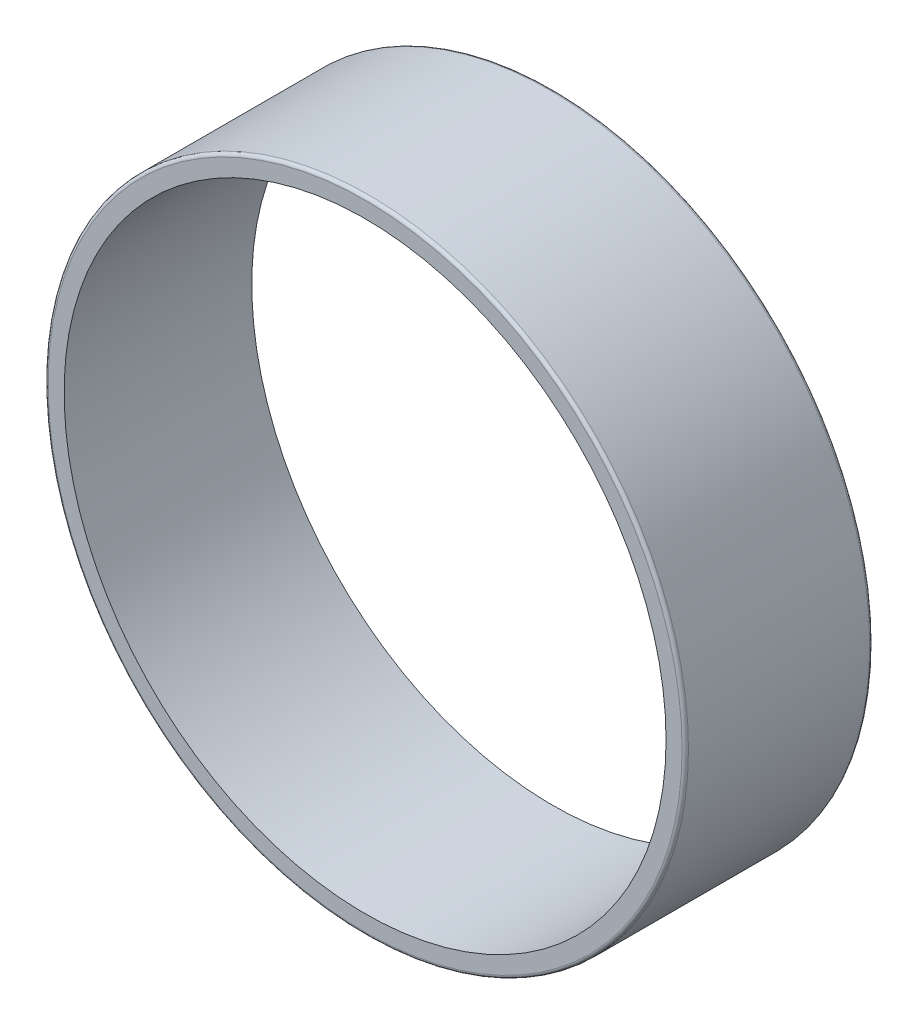
ISO-10303-21;
HEADER;
FILE_DESCRIPTION(('STEP AP214'),'2;1');
FILE_NAME('part.step','',(''),(''),'','','');
FILE_SCHEMA(('AUTOMOTIVE_DESIGN { 1 0 10303 214 1 1 1 1 }'));
ENDSEC;
DATA;
#1=APPLICATION_CONTEXT('core data for automotive mechanical design processes');
#2=APPLICATION_PROTOCOL_DEFINITION('international standard','automotive_design',2000,#1);
#3=PRODUCT_CONTEXT('',#1,'mechanical');
#4=PRODUCT('Part','Part','',(#3));
#5=PRODUCT_RELATED_PRODUCT_CATEGORY('part','',(#4));
#6=PRODUCT_DEFINITION_FORMATION('','',#4);
#7=PRODUCT_DEFINITION_CONTEXT('part definition',#1,'design');
#8=PRODUCT_DEFINITION('design','',#6,#7);
#9=PRODUCT_DEFINITION_SHAPE('','',#8);
#10=(LENGTH_UNIT() NAMED_UNIT(*) SI_UNIT(.MILLI.,.METRE.));
#11=(NAMED_UNIT(*) PLANE_ANGLE_UNIT() SI_UNIT($,.RADIAN.));
#12=(NAMED_UNIT(*) SI_UNIT($,.STERADIAN.) SOLID_ANGLE_UNIT());
#13=UNCERTAINTY_MEASURE_WITH_UNIT(LENGTH_MEASURE(1.E-05),#10,'distance_accuracy_value','');
#14=(GEOMETRIC_REPRESENTATION_CONTEXT(3) GLOBAL_UNCERTAINTY_ASSIGNED_CONTEXT((#13)) GLOBAL_UNIT_ASSIGNED_CONTEXT((#10,
#11,#12)) REPRESENTATION_CONTEXT('',''));
#15=CARTESIAN_POINT('',(0.,0.,0.));
#16=DIRECTION('',(0.,0.,1.));
#17=DIRECTION('',(1.,0.,0.));
#18=AXIS2_PLACEMENT_3D('',#15,#16,#17);
#19=CARTESIAN_POINT('',(0.,0.,29.3));
#20=DIRECTION('',(0.,0.,1.));
#21=DIRECTION('',(1.,0.,0.));
#22=AXIS2_PLACEMENT_3D('',#19,#20,#21);
#23=PLANE('',#22);
#24=CARTESIAN_POINT('',(0.,0.,29.3));
#25=DIRECTION('',(0.,0.,1.));
#26=DIRECTION('',(1.,0.,0.));
#27=AXIS2_PLACEMENT_3D('',#24,#25,#26);
#28=CIRCLE('',#27,49.5);
#29=CARTESIAN_POINT('',(49.5,0.,29.3));
#30=VERTEX_POINT('',#29);
#31=EDGE_CURVE('E10',#30,#30,#28,.T.);
#32=ORIENTED_EDGE('',*,*,#31,.T.);
#33=EDGE_LOOP('',(#32));
#34=FACE_BOUND('',#33,.T.);
#35=CARTESIAN_POINT('',(0.,0.,29.3));
#36=DIRECTION('',(0.,0.,1.));
#37=DIRECTION('',(1.,0.,0.));
#38=AXIS2_PLACEMENT_3D('',#35,#36,#37);
#39=CIRCLE('',#38,47.);
#40=CARTESIAN_POINT('',(47.,0.,29.3));
#41=VERTEX_POINT('',#40);
#42=EDGE_CURVE('E63',#41,#41,#39,.T.);
#43=ORIENTED_EDGE('',*,*,#42,.F.);
#44=EDGE_LOOP('',(#43));
#45=FACE_BOUND('',#44,.T.);
#46=ADVANCED_FACE('F39',(#34,#45),#23,.T.);
#47=CARTESIAN_POINT('',(0.,0.,0.));
#48=DIRECTION('',(0.,0.,1.));
#49=DIRECTION('',(1.,0.,0.));
#50=AXIS2_PLACEMENT_3D('',#47,#48,#49);
#51=PLANE('',#50);
#52=CARTESIAN_POINT('',(0.,0.,0.));
#53=DIRECTION('',(0.,0.,1.));
#54=DIRECTION('',(1.,0.,0.));
#55=AXIS2_PLACEMENT_3D('',#52,#53,#54);
#56=CIRCLE('',#55,49.5);
#57=CARTESIAN_POINT('',(49.5,0.,0.));
#58=VERTEX_POINT('',#57);
#59=EDGE_CURVE('E47',#58,#58,#56,.F.);
#60=ORIENTED_EDGE('',*,*,#59,.T.);
#61=EDGE_LOOP('',(#60));
#62=FACE_BOUND('',#61,.T.);
#63=CARTESIAN_POINT('',(0.,0.,0.));
#64=DIRECTION('',(0.,0.,1.));
#65=DIRECTION('',(1.,0.,0.));
#66=AXIS2_PLACEMENT_3D('',#63,#64,#65);
#67=CIRCLE('',#66,47.);
#68=CARTESIAN_POINT('',(47.,0.,0.));
#69=VERTEX_POINT('',#68);
#70=EDGE_CURVE('E64',#69,#69,#67,.T.);
#71=ORIENTED_EDGE('',*,*,#70,.T.);
#72=EDGE_LOOP('',(#71));
#73=FACE_BOUND('',#72,.T.);
#74=ADVANCED_FACE('F76',(#62,#73),#51,.F.);
#75=CARTESIAN_POINT('',(0.,0.,29.3));
#76=DIRECTION('',(0.,0.,-1.));
#77=DIRECTION('',(-1.,0.,0.));
#78=AXIS2_PLACEMENT_3D('',#75,#76,#77);
#79=CYLINDRICAL_SURFACE('',#78,50.);
#80=CARTESIAN_POINT('',(0.,0.,0.5));
#81=DIRECTION('',(0.,0.,1.));
#82=DIRECTION('',(1.,0.,0.));
#83=AXIS2_PLACEMENT_3D('',#80,#81,#82);
#84=CIRCLE('',#83,50.);
#85=CARTESIAN_POINT('',(50.,0.,0.5));
#86=VERTEX_POINT('',#85);
#87=EDGE_CURVE('E52',#86,#86,#84,.T.);
#88=ORIENTED_EDGE('',*,*,#87,.T.);
#89=EDGE_LOOP('',(#88));
#90=FACE_BOUND('',#89,.T.);
#91=CARTESIAN_POINT('',(0.,0.,28.8));
#92=DIRECTION('',(0.,0.,1.));
#93=DIRECTION('',(1.,0.,0.));
#94=AXIS2_PLACEMENT_3D('',#91,#92,#93);
#95=CIRCLE('',#94,50.);
#96=CARTESIAN_POINT('',(50.,0.,28.8));
#97=VERTEX_POINT('',#96);
#98=EDGE_CURVE('E57',#97,#97,#95,.F.);
#99=ORIENTED_EDGE('',*,*,#98,.T.);
#100=EDGE_LOOP('',(#99));
#101=FACE_BOUND('',#100,.T.);
#102=ADVANCED_FACE('F81',(#90,#101),#79,.T.);
#103=CARTESIAN_POINT('',(0.,0.,29.3));
#104=DIRECTION('',(0.,0.,-1.));
#105=DIRECTION('',(-1.,0.,0.));
#106=AXIS2_PLACEMENT_3D('',#103,#104,#105);
#107=CYLINDRICAL_SURFACE('',#106,47.);
#108=ORIENTED_EDGE('',*,*,#42,.T.);
#109=EDGE_LOOP('',(#108));
#110=FACE_BOUND('',#109,.T.);
#111=ORIENTED_EDGE('',*,*,#70,.F.);
#112=EDGE_LOOP('',(#111));
#113=FACE_BOUND('',#112,.T.);
#114=ADVANCED_FACE('F72',(#110,#113),#107,.F.);
#115=CARTESIAN_POINT('',(0.,0.,0.5));
#116=DIRECTION('',(0.,0.,1.));
#117=DIRECTION('',(1.,0.,0.));
#118=AXIS2_PLACEMENT_3D('',#115,#116,#117);
#119=TOROIDAL_SURFACE('',#118,49.5,0.5);
#120=ORIENTED_EDGE('',*,*,#59,.F.);
#121=EDGE_LOOP('',(#120));
#122=FACE_BOUND('',#121,.T.);
#123=ORIENTED_EDGE('',*,*,#87,.F.);
#124=EDGE_LOOP('',(#123));
#125=FACE_BOUND('',#124,.T.);
#126=ADVANCED_FACE('F87',(#122,#125),#119,.T.);
#127=CARTESIAN_POINT('',(0.,0.,28.8));
#128=DIRECTION('',(0.,0.,1.));
#129=DIRECTION('',(1.,0.,0.));
#130=AXIS2_PLACEMENT_3D('',#127,#128,#129);
#131=TOROIDAL_SURFACE('',#130,49.5,0.5);
#132=ORIENTED_EDGE('',*,*,#98,.F.);
#133=EDGE_LOOP('',(#132));
#134=FACE_BOUND('',#133,.T.);
#135=ORIENTED_EDGE('',*,*,#31,.F.);
#136=EDGE_LOOP('',(#135));
#137=FACE_BOUND('',#136,.T.);
#138=ADVANCED_FACE('F41',(#134,#137),#131,.T.);
#139=CLOSED_SHELL('',(#46,#74,#102,#114,#126,#138));
#140=MANIFOLD_SOLID_BREP('B2',#139);
#141=ADVANCED_BREP_SHAPE_REPRESENTATION('',(#18,#140),#14);
#142=SHAPE_DEFINITION_REPRESENTATION(#9,#141);
ENDSEC;
END-ISO-10303-21;
